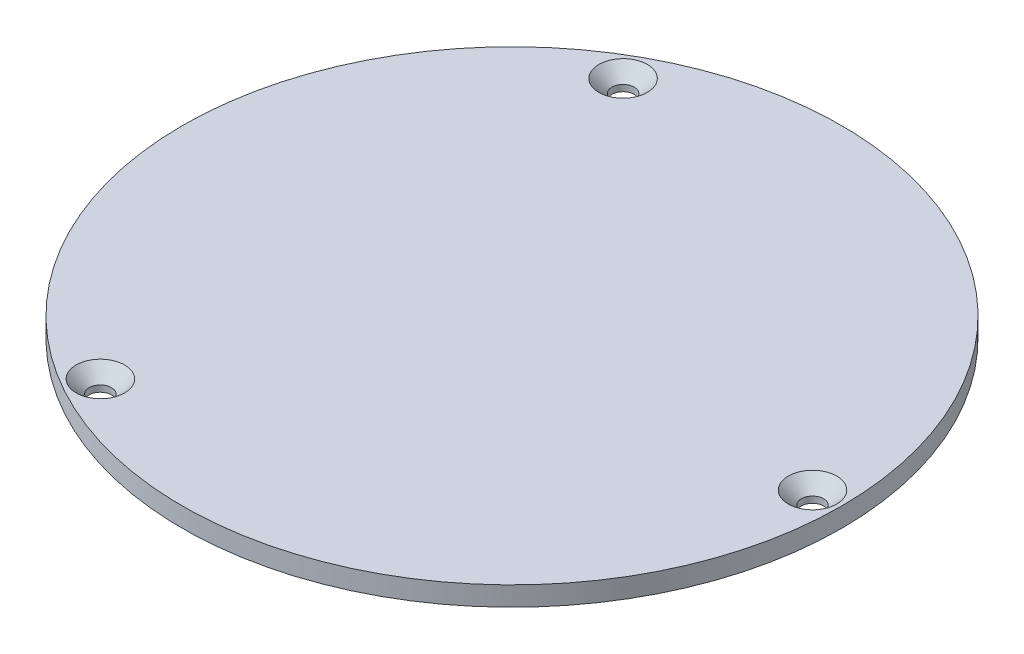
ISO-10303-21;
HEADER;
FILE_DESCRIPTION(('STEP AP214'),'2;1');
FILE_NAME('part.step','',(''),(''),'','','');
FILE_SCHEMA(('AUTOMOTIVE_DESIGN { 1 0 10303 214 1 1 1 1 }'));
ENDSEC;
DATA;
#1=APPLICATION_CONTEXT('core data for automotive mechanical design processes');
#2=APPLICATION_PROTOCOL_DEFINITION('international standard','automotive_design',2000,#1);
#3=PRODUCT_CONTEXT('',#1,'mechanical');
#4=PRODUCT('Part','Part','',(#3));
#5=PRODUCT_RELATED_PRODUCT_CATEGORY('part','',(#4));
#6=PRODUCT_DEFINITION_FORMATION('','',#4);
#7=PRODUCT_DEFINITION_CONTEXT('part definition',#1,'design');
#8=PRODUCT_DEFINITION('design','',#6,#7);
#9=PRODUCT_DEFINITION_SHAPE('','',#8);
#10=(LENGTH_UNIT() NAMED_UNIT(*) SI_UNIT(.MILLI.,.METRE.));
#11=(NAMED_UNIT(*) PLANE_ANGLE_UNIT() SI_UNIT($,.RADIAN.));
#12=(NAMED_UNIT(*) SI_UNIT($,.STERADIAN.) SOLID_ANGLE_UNIT());
#13=UNCERTAINTY_MEASURE_WITH_UNIT(LENGTH_MEASURE(1.E-05),#10,'distance_accuracy_value','');
#14=(GEOMETRIC_REPRESENTATION_CONTEXT(3) GLOBAL_UNCERTAINTY_ASSIGNED_CONTEXT((#13)) GLOBAL_UNIT_ASSIGNED_CONTEXT((#10,
#11,#12)) REPRESENTATION_CONTEXT('',''));
#15=CARTESIAN_POINT('',(0.,0.,0.));
#16=DIRECTION('',(0.,0.,1.));
#17=DIRECTION('',(1.,0.,0.));
#18=AXIS2_PLACEMENT_3D('',#15,#16,#17);
#19=CARTESIAN_POINT('',(-1.80819141723826,48.6763065689202,1.16585878911657));
#20=DIRECTION('',(0.,1.,0.));
#21=DIRECTION('',(-1.,0.,0.));
#22=AXIS2_PLACEMENT_3D('',#19,#20,#21);
#23=CYLINDRICAL_SURFACE('',#22,34.);
#24=CARTESIAN_POINT('',(-1.80819141723826,48.6763065689202,1.16585878911657));
#25=DIRECTION('',(0.,1.,0.));
#26=DIRECTION('',(-1.,0.,0.));
#27=AXIS2_PLACEMENT_3D('',#24,#25,#26);
#28=CIRCLE('',#27,34.);
#29=CARTESIAN_POINT('',(-35.8081914172383,48.6763065689203,1.16585878911657));
#30=VERTEX_POINT('',#29);
#31=EDGE_CURVE('E10',#30,#30,#28,.T.);
#32=ORIENTED_EDGE('',*,*,#31,.T.);
#33=EDGE_LOOP('',(#32));
#34=FACE_BOUND('',#33,.T.);
#35=CARTESIAN_POINT('',(-1.80819141723825,50.6763065689202,1.16585878911657));
#36=DIRECTION('',(0.,1.,0.));
#37=DIRECTION('',(-1.,0.,0.));
#38=AXIS2_PLACEMENT_3D('',#35,#36,#37);
#39=CIRCLE('',#38,34.);
#40=CARTESIAN_POINT('',(-35.8081914172383,50.6763065689203,1.16585878911657));
#41=VERTEX_POINT('',#40);
#42=EDGE_CURVE('E42',#41,#41,#39,.T.);
#43=ORIENTED_EDGE('',*,*,#42,.F.);
#44=EDGE_LOOP('',(#43));
#45=FACE_BOUND('',#44,.T.);
#46=ADVANCED_FACE('F35',(#34,#45),#23,.T.);
#47=CARTESIAN_POINT('',(-1.80819141723826,48.6763065689202,1.16585878911657));
#48=DIRECTION('',(0.,1.,0.));
#49=DIRECTION('',(-1.,0.,0.));
#50=AXIS2_PLACEMENT_3D('',#47,#48,#49);
#51=PLANE('',#50);
#52=CARTESIAN_POINT('',(-17.3999686920678,48.6763065689203,28.0399908971999));
#53=DIRECTION('',(0.,1.,0.));
#54=DIRECTION('',(-1.,0.,0.));
#55=AXIS2_PLACEMENT_3D('',#52,#53,#54);
#56=CIRCLE('',#55,1.15);
#57=CARTESIAN_POINT('',(-18.5499686920678,48.6763065689203,28.0399908971999));
#58=VERTEX_POINT('',#57);
#59=EDGE_CURVE('E38',#58,#58,#56,.T.);
#60=ORIENTED_EDGE('',*,*,#59,.T.);
#61=EDGE_LOOP('',(#60));
#62=FACE_BOUND('',#61,.T.);
#63=CARTESIAN_POINT('',(29.2613783304358,48.6763065689201,1.2316679452261));
#64=DIRECTION('',(0.,1.,0.));
#65=DIRECTION('',(-1.,0.,0.));
#66=AXIS2_PLACEMENT_3D('',#63,#64,#65);
#67=CIRCLE('',#66,1.15);
#68=CARTESIAN_POINT('',(28.1113783304358,48.6763065689201,1.2316679452261));
#69=VERTEX_POINT('',#68);
#70=EDGE_CURVE('E54',#69,#69,#67,.T.);
#71=ORIENTED_EDGE('',*,*,#70,.T.);
#72=EDGE_LOOP('',(#71));
#73=FACE_BOUND('',#72,.T.);
#74=CARTESIAN_POINT('',(-17.2859838900829,48.6763065689203,-25.7740824750763));
#75=DIRECTION('',(0.,1.,0.));
#76=DIRECTION('',(-1.,0.,0.));
#77=AXIS2_PLACEMENT_3D('',#74,#75,#76);
#78=CIRCLE('',#77,1.15);
#79=CARTESIAN_POINT('',(-18.4359838900829,48.6763065689203,-25.7740824750763));
#80=VERTEX_POINT('',#79);
#81=EDGE_CURVE('E47',#80,#80,#78,.T.);
#82=ORIENTED_EDGE('',*,*,#81,.T.);
#83=EDGE_LOOP('',(#82));
#84=FACE_BOUND('',#83,.T.);
#85=ORIENTED_EDGE('',*,*,#31,.F.);
#86=EDGE_LOOP('',(#85));
#87=FACE_BOUND('',#86,.T.);
#88=ADVANCED_FACE('F82',(#62,#73,#84,#87),#51,.F.);
#89=CARTESIAN_POINT('',(-1.80819141723825,50.6763065689202,1.16585878911657));
#90=DIRECTION('',(0.,1.,0.));
#91=DIRECTION('',(-1.,0.,0.));
#92=AXIS2_PLACEMENT_3D('',#89,#90,#91);
#93=PLANE('',#92);
#94=CARTESIAN_POINT('',(-17.3999686920678,50.6763065689203,28.0399908971999));
#95=DIRECTION('',(0.,1.,0.));
#96=DIRECTION('',(0.,0.,1.));
#97=AXIS2_PLACEMENT_3D('',#94,#95,#96);
#98=CIRCLE('',#97,2.5);
#99=CARTESIAN_POINT('',(-17.3999686920678,50.6763065689203,30.5399908971999));
#100=VERTEX_POINT('',#99);
#101=EDGE_CURVE('E72',#100,#100,#98,.T.);
#102=ORIENTED_EDGE('',*,*,#101,.F.);
#103=EDGE_LOOP('',(#102));
#104=FACE_BOUND('',#103,.T.);
#105=CARTESIAN_POINT('',(29.2613783304358,50.6763065689201,1.2316679452261));
#106=DIRECTION('',(0.,1.,0.));
#107=DIRECTION('',(0.,0.,1.));
#108=AXIS2_PLACEMENT_3D('',#105,#106,#107);
#109=CIRCLE('',#108,2.5);
#110=CARTESIAN_POINT('',(29.2613783304358,50.6763065689201,3.7316679452261));
#111=VERTEX_POINT('',#110);
#112=EDGE_CURVE('E62',#111,#111,#109,.T.);
#113=ORIENTED_EDGE('',*,*,#112,.F.);
#114=EDGE_LOOP('',(#113));
#115=FACE_BOUND('',#114,.T.);
#116=CARTESIAN_POINT('',(-17.2859838900829,50.6763065689203,-25.7740824750763));
#117=DIRECTION('',(0.,1.,0.));
#118=DIRECTION('',(0.,0.,1.));
#119=AXIS2_PLACEMENT_3D('',#116,#117,#118);
#120=CIRCLE('',#119,2.5);
#121=CARTESIAN_POINT('',(-17.2859838900829,50.6763065689203,-23.2740824750763));
#122=VERTEX_POINT('',#121);
#123=EDGE_CURVE('E56',#122,#122,#120,.T.);
#124=ORIENTED_EDGE('',*,*,#123,.F.);
#125=EDGE_LOOP('',(#124));
#126=FACE_BOUND('',#125,.T.);
#127=ORIENTED_EDGE('',*,*,#42,.T.);
#128=EDGE_LOOP('',(#127));
#129=FACE_BOUND('',#128,.T.);
#130=ADVANCED_FACE('F78',(#104,#115,#126,#129),#93,.T.);
#131=CARTESIAN_POINT('',(-17.2859838900829,50.6763065689203,-25.7740824750763));
#132=DIRECTION('',(0.,1.,0.));
#133=DIRECTION('',(0.,0.,1.));
#134=AXIS2_PLACEMENT_3D('',#131,#132,#133);
#135=CYLINDRICAL_SURFACE('',#134,1.15);
#136=CARTESIAN_POINT('',(-17.2859838900829,49.3263065689203,-25.7740824750763));
#137=DIRECTION('',(0.,1.,0.));
#138=DIRECTION('',(0.,0.,1.));
#139=AXIS2_PLACEMENT_3D('',#136,#137,#138);
#140=CIRCLE('',#139,1.15);
#141=CARTESIAN_POINT('',(-17.2859838900829,49.3263065689203,-24.6240824750763));
#142=VERTEX_POINT('',#141);
#143=EDGE_CURVE('E50',#142,#142,#140,.T.);
#144=ORIENTED_EDGE('',*,*,#143,.T.);
#145=EDGE_LOOP('',(#144));
#146=FACE_BOUND('',#145,.T.);
#147=ORIENTED_EDGE('',*,*,#81,.F.);
#148=EDGE_LOOP('',(#147));
#149=FACE_BOUND('',#148,.T.);
#150=ADVANCED_FACE('F81',(#146,#149),#135,.F.);
#151=CARTESIAN_POINT('',(-17.2859838900829,50.6763065689203,-25.7740824750763));
#152=DIRECTION('',(0.,1.,0.));
#153=DIRECTION('',(0.,0.,1.));
#154=AXIS2_PLACEMENT_3D('',#151,#152,#153);
#155=CONICAL_SURFACE('',#154,2.5,0.785398163397448);
#156=ORIENTED_EDGE('',*,*,#143,.F.);
#157=EDGE_LOOP('',(#156));
#158=FACE_BOUND('',#157,.T.);
#159=ORIENTED_EDGE('',*,*,#123,.T.);
#160=EDGE_LOOP('',(#159));
#161=FACE_BOUND('',#160,.T.);
#162=ADVANCED_FACE('F101',(#158,#161),#155,.F.);
#163=CARTESIAN_POINT('',(29.2613783304358,50.6763065689201,1.2316679452261));
#164=DIRECTION('',(0.,1.,0.));
#165=DIRECTION('',(0.,0.,1.));
#166=AXIS2_PLACEMENT_3D('',#163,#164,#165);
#167=CYLINDRICAL_SURFACE('',#166,1.15);
#168=CARTESIAN_POINT('',(29.2613783304358,49.3263065689201,1.2316679452261));
#169=DIRECTION('',(0.,1.,0.));
#170=DIRECTION('',(0.,0.,1.));
#171=AXIS2_PLACEMENT_3D('',#168,#169,#170);
#172=CIRCLE('',#171,1.15);
#173=CARTESIAN_POINT('',(29.2613783304358,49.3263065689201,2.3816679452261));
#174=VERTEX_POINT('',#173);
#175=EDGE_CURVE('E57',#174,#174,#172,.T.);
#176=ORIENTED_EDGE('',*,*,#175,.T.);
#177=EDGE_LOOP('',(#176));
#178=FACE_BOUND('',#177,.T.);
#179=ORIENTED_EDGE('',*,*,#70,.F.);
#180=EDGE_LOOP('',(#179));
#181=FACE_BOUND('',#180,.T.);
#182=ADVANCED_FACE('F105',(#178,#181),#167,.F.);
#183=CARTESIAN_POINT('',(29.2613783304358,50.6763065689201,1.2316679452261));
#184=DIRECTION('',(0.,1.,0.));
#185=DIRECTION('',(0.,0.,1.));
#186=AXIS2_PLACEMENT_3D('',#183,#184,#185);
#187=CONICAL_SURFACE('',#186,2.5,0.785398163397448);
#188=ORIENTED_EDGE('',*,*,#175,.F.);
#189=EDGE_LOOP('',(#188));
#190=FACE_BOUND('',#189,.T.);
#191=ORIENTED_EDGE('',*,*,#112,.T.);
#192=EDGE_LOOP('',(#191));
#193=FACE_BOUND('',#192,.T.);
#194=ADVANCED_FACE('F109',(#190,#193),#187,.F.);
#195=CARTESIAN_POINT('',(-17.3999686920678,50.6763065689203,28.0399908971999));
#196=DIRECTION('',(0.,1.,0.));
#197=DIRECTION('',(0.,0.,1.));
#198=AXIS2_PLACEMENT_3D('',#195,#196,#197);
#199=CYLINDRICAL_SURFACE('',#198,1.15);
#200=CARTESIAN_POINT('',(-17.3999686920678,49.3263065689203,28.0399908971999));
#201=DIRECTION('',(0.,1.,0.));
#202=DIRECTION('',(0.,0.,1.));
#203=AXIS2_PLACEMENT_3D('',#200,#201,#202);
#204=CIRCLE('',#203,1.15);
#205=CARTESIAN_POINT('',(-17.3999686920678,49.3263065689203,29.1899908971999));
#206=VERTEX_POINT('',#205);
#207=EDGE_CURVE('E69',#206,#206,#204,.T.);
#208=ORIENTED_EDGE('',*,*,#207,.T.);
#209=EDGE_LOOP('',(#208));
#210=FACE_BOUND('',#209,.T.);
#211=ORIENTED_EDGE('',*,*,#59,.F.);
#212=EDGE_LOOP('',(#211));
#213=FACE_BOUND('',#212,.T.);
#214=ADVANCED_FACE('F112',(#210,#213),#199,.F.);
#215=CARTESIAN_POINT('',(-17.3999686920678,50.6763065689203,28.0399908971999));
#216=DIRECTION('',(0.,1.,0.));
#217=DIRECTION('',(0.,0.,1.));
#218=AXIS2_PLACEMENT_3D('',#215,#216,#217);
#219=CONICAL_SURFACE('',#218,2.5,0.785398163397448);
#220=ORIENTED_EDGE('',*,*,#207,.F.);
#221=EDGE_LOOP('',(#220));
#222=FACE_BOUND('',#221,.T.);
#223=ORIENTED_EDGE('',*,*,#101,.T.);
#224=EDGE_LOOP('',(#223));
#225=FACE_BOUND('',#224,.T.);
#226=ADVANCED_FACE('F76',(#222,#225),#219,.F.);
#227=CLOSED_SHELL('',(#46,#88,#130,#150,#162,#182,#194,#214,#226));
#228=MANIFOLD_SOLID_BREP('B2',#227);
#229=ADVANCED_BREP_SHAPE_REPRESENTATION('',(#18,#228),#14);
#230=SHAPE_DEFINITION_REPRESENTATION(#9,#229);
ENDSEC;
END-ISO-10303-21;
